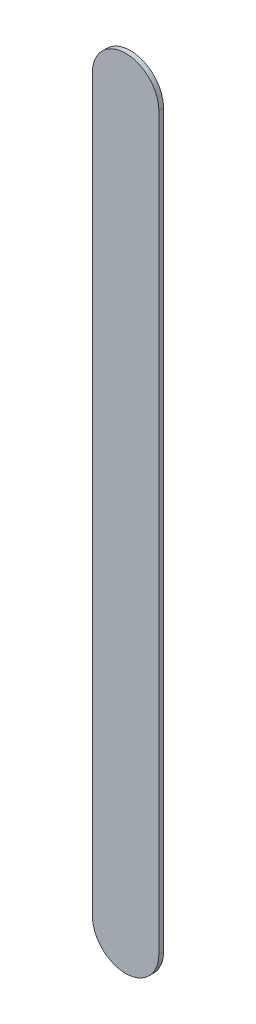
ISO-10303-21;
HEADER;
FILE_DESCRIPTION(('STEP AP214'),'2;1');
FILE_NAME('part.step','',(''),(''),'','','');
FILE_SCHEMA(('AUTOMOTIVE_DESIGN { 1 0 10303 214 1 1 1 1 }'));
ENDSEC;
DATA;
#1=APPLICATION_CONTEXT('core data for automotive mechanical design processes');
#2=APPLICATION_PROTOCOL_DEFINITION('international standard','automotive_design',2000,#1);
#3=PRODUCT_CONTEXT('',#1,'mechanical');
#4=PRODUCT('Part','Part','',(#3));
#5=PRODUCT_RELATED_PRODUCT_CATEGORY('part','',(#4));
#6=PRODUCT_DEFINITION_FORMATION('','',#4);
#7=PRODUCT_DEFINITION_CONTEXT('part definition',#1,'design');
#8=PRODUCT_DEFINITION('design','',#6,#7);
#9=PRODUCT_DEFINITION_SHAPE('','',#8);
#10=(LENGTH_UNIT() NAMED_UNIT(*) SI_UNIT(.MILLI.,.METRE.));
#11=(NAMED_UNIT(*) PLANE_ANGLE_UNIT() SI_UNIT($,.RADIAN.));
#12=(NAMED_UNIT(*) SI_UNIT($,.STERADIAN.) SOLID_ANGLE_UNIT());
#13=UNCERTAINTY_MEASURE_WITH_UNIT(LENGTH_MEASURE(1.E-05),#10,'distance_accuracy_value','');
#14=(GEOMETRIC_REPRESENTATION_CONTEXT(3) GLOBAL_UNCERTAINTY_ASSIGNED_CONTEXT((#13)) GLOBAL_UNIT_ASSIGNED_CONTEXT((#10,
#11,#12)) REPRESENTATION_CONTEXT('',''));
#15=CARTESIAN_POINT('',(0.,0.,0.));
#16=DIRECTION('',(0.,0.,1.));
#17=DIRECTION('',(1.,0.,0.));
#18=AXIS2_PLACEMENT_3D('',#15,#16,#17);
#19=CARTESIAN_POINT('',(35.51757692,99.86757776,0.));
#20=DIRECTION('',(-1.,0.,0.));
#21=DIRECTION('',(0.,1.,0.));
#22=AXIS2_PLACEMENT_3D('',#19,#20,#21);
#23=PLANE('',#22);
#24=DIRECTION('',(0.,1.,0.));
#25=VECTOR('',#24,1.);
#26=CARTESIAN_POINT('',(35.51757692,99.86757776,0.03556));
#27=LINE('',#26,#25);
#28=CARTESIAN_POINT('',(35.51757692,99.86757776,0.03556));
#29=VERTEX_POINT('',#28);
#30=CARTESIAN_POINT('',(35.51757692,105.36757692,0.03556));
#31=VERTEX_POINT('',#30);
#32=EDGE_CURVE('E11',#29,#31,#27,.T.);
#33=ORIENTED_EDGE('',*,*,#32,.F.);
#34=DIRECTION('',(0.,0.,1.));
#35=VECTOR('',#34,1.);
#36=CARTESIAN_POINT('',(35.51757692,99.86757776,0.));
#37=LINE('',#36,#35);
#38=CARTESIAN_POINT('',(35.51757692,99.86757776,0.));
#39=VERTEX_POINT('',#38);
#40=EDGE_CURVE('E24',#39,#29,#37,.T.);
#41=ORIENTED_EDGE('',*,*,#40,.F.);
#42=DIRECTION('',(0.,1.,0.));
#43=VECTOR('',#42,1.);
#44=CARTESIAN_POINT('',(35.51757692,99.86757776,0.));
#45=LINE('',#44,#43);
#46=CARTESIAN_POINT('',(35.51757692,105.36757692,0.));
#47=VERTEX_POINT('',#46);
#48=EDGE_CURVE('E75',#39,#47,#45,.T.);
#49=ORIENTED_EDGE('',*,*,#48,.T.);
#50=DIRECTION('',(0.,0.,1.));
#51=VECTOR('',#50,1.);
#52=CARTESIAN_POINT('',(35.51757692,105.36757692,0.));
#53=LINE('',#52,#51);
#54=EDGE_CURVE('E37',#47,#31,#53,.T.);
#55=ORIENTED_EDGE('',*,*,#54,.T.);
#56=EDGE_LOOP('',(#33,#41,#49,#55));
#57=FACE_BOUND('',#56,.T.);
#58=ADVANCED_FACE('F17',(#57),#23,.F.);
#59=CARTESIAN_POINT('',(35.26757742,105.36757692,0.));
#60=DIRECTION('',(0.,0.,-1.));
#61=DIRECTION('',(1.,0.,0.));
#62=AXIS2_PLACEMENT_3D('',#59,#60,#61);
#63=CYLINDRICAL_SURFACE('',#62,0.249999499999994);
#64=CARTESIAN_POINT('',(35.26757742,105.36757692,0.03556));
#65=DIRECTION('',(0.,0.,1.));
#66=DIRECTION('',(1.,0.,0.));
#67=AXIS2_PLACEMENT_3D('',#64,#65,#66);
#68=CIRCLE('',#67,0.249999499999994);
#69=CARTESIAN_POINT('',(35.01757792,105.36757692,0.03556));
#70=VERTEX_POINT('',#69);
#71=EDGE_CURVE('E83',#31,#70,#68,.T.);
#72=ORIENTED_EDGE('',*,*,#71,.F.);
#73=ORIENTED_EDGE('',*,*,#54,.F.);
#74=CARTESIAN_POINT('',(35.26757742,105.36757692,0.));
#75=DIRECTION('',(0.,0.,1.));
#76=DIRECTION('',(1.,0.,0.));
#77=AXIS2_PLACEMENT_3D('',#74,#75,#76);
#78=CIRCLE('',#77,0.249999499999994);
#79=CARTESIAN_POINT('',(35.01757792,105.36757692,0.));
#80=VERTEX_POINT('',#79);
#81=EDGE_CURVE('E81',#47,#80,#78,.T.);
#82=ORIENTED_EDGE('',*,*,#81,.T.);
#83=DIRECTION('',(0.,0.,1.));
#84=VECTOR('',#83,1.);
#85=CARTESIAN_POINT('',(35.01757792,105.36757692,0.));
#86=LINE('',#85,#84);
#87=EDGE_CURVE('E67',#80,#70,#86,.T.);
#88=ORIENTED_EDGE('',*,*,#87,.T.);
#89=EDGE_LOOP('',(#72,#73,#82,#88));
#90=FACE_BOUND('',#89,.T.);
#91=ADVANCED_FACE('F89',(#90),#63,.T.);
#92=CARTESIAN_POINT('',(35.01757792,105.36757692,0.));
#93=DIRECTION('',(1.,0.,0.));
#94=DIRECTION('',(0.,-1.,0.));
#95=AXIS2_PLACEMENT_3D('',#92,#93,#94);
#96=PLANE('',#95);
#97=DIRECTION('',(0.,-1.,0.));
#98=VECTOR('',#97,1.);
#99=CARTESIAN_POINT('',(35.01757792,105.36757692,0.03556));
#100=LINE('',#99,#98);
#101=CARTESIAN_POINT('',(35.01757792,99.86757776,0.03556));
#102=VERTEX_POINT('',#101);
#103=EDGE_CURVE('E71',#70,#102,#100,.T.);
#104=ORIENTED_EDGE('',*,*,#103,.F.);
#105=ORIENTED_EDGE('',*,*,#87,.F.);
#106=DIRECTION('',(0.,-1.,0.));
#107=VECTOR('',#106,1.);
#108=CARTESIAN_POINT('',(35.01757792,105.36757692,0.));
#109=LINE('',#108,#107);
#110=CARTESIAN_POINT('',(35.01757792,99.86757776,0.));
#111=VERTEX_POINT('',#110);
#112=EDGE_CURVE('E63',#80,#111,#109,.T.);
#113=ORIENTED_EDGE('',*,*,#112,.T.);
#114=DIRECTION('',(0.,0.,1.));
#115=VECTOR('',#114,1.);
#116=CARTESIAN_POINT('',(35.01757792,99.86757776,0.));
#117=LINE('',#116,#115);
#118=EDGE_CURVE('E53',#111,#102,#117,.T.);
#119=ORIENTED_EDGE('',*,*,#118,.T.);
#120=EDGE_LOOP('',(#104,#105,#113,#119));
#121=FACE_BOUND('',#120,.T.);
#122=ADVANCED_FACE('F66',(#121),#96,.F.);
#123=CARTESIAN_POINT('',(35.26757742,99.86757776,0.));
#124=DIRECTION('',(0.,0.,-1.));
#125=DIRECTION('',(-1.,0.,0.));
#126=AXIS2_PLACEMENT_3D('',#123,#124,#125);
#127=CYLINDRICAL_SURFACE('',#126,0.249999499999999);
#128=CARTESIAN_POINT('',(35.26757742,99.86757776,0.03556));
#129=DIRECTION('',(0.,0.,1.));
#130=DIRECTION('',(-1.,0.,0.));
#131=AXIS2_PLACEMENT_3D('',#128,#129,#130);
#132=CIRCLE('',#131,0.249999499999999);
#133=EDGE_CURVE('E59',#102,#29,#132,.T.);
#134=ORIENTED_EDGE('',*,*,#133,.F.);
#135=ORIENTED_EDGE('',*,*,#118,.F.);
#136=CARTESIAN_POINT('',(35.26757742,99.86757776,0.));
#137=DIRECTION('',(0.,0.,1.));
#138=DIRECTION('',(-1.,0.,0.));
#139=AXIS2_PLACEMENT_3D('',#136,#137,#138);
#140=CIRCLE('',#139,0.249999499999999);
#141=EDGE_CURVE('E57',#111,#39,#140,.T.);
#142=ORIENTED_EDGE('',*,*,#141,.T.);
#143=ORIENTED_EDGE('',*,*,#40,.T.);
#144=EDGE_LOOP('',(#134,#135,#142,#143));
#145=FACE_BOUND('',#144,.T.);
#146=ADVANCED_FACE('F55',(#145),#127,.T.);
#147=CARTESIAN_POINT('',(35.51757692,99.86757776,0.));
#148=DIRECTION('',(0.,0.,-1.));
#149=DIRECTION('',(-1.,0.,0.));
#150=AXIS2_PLACEMENT_3D('',#147,#148,#149);
#151=PLANE('',#150);
#152=ORIENTED_EDGE('',*,*,#141,.F.);
#153=ORIENTED_EDGE('',*,*,#112,.F.);
#154=ORIENTED_EDGE('',*,*,#81,.F.);
#155=ORIENTED_EDGE('',*,*,#48,.F.);
#156=EDGE_LOOP('',(#152,#153,#154,#155));
#157=FACE_BOUND('',#156,.T.);
#158=ADVANCED_FACE('F74',(#157),#151,.T.);
#159=CARTESIAN_POINT('',(35.51757692,99.86757776,0.03556));
#160=DIRECTION('',(0.,0.,-1.));
#161=DIRECTION('',(-1.,0.,0.));
#162=AXIS2_PLACEMENT_3D('',#159,#160,#161);
#163=PLANE('',#162);
#164=ORIENTED_EDGE('',*,*,#32,.T.);
#165=ORIENTED_EDGE('',*,*,#71,.T.);
#166=ORIENTED_EDGE('',*,*,#103,.T.);
#167=ORIENTED_EDGE('',*,*,#133,.T.);
#168=EDGE_LOOP('',(#164,#165,#166,#167));
#169=FACE_BOUND('',#168,.T.);
#170=ADVANCED_FACE('F91',(#169),#163,.F.);
#171=CLOSED_SHELL('',(#58,#91,#122,#146,#158,#170));
#172=MANIFOLD_SOLID_BREP('B1',#171);
#173=ADVANCED_BREP_SHAPE_REPRESENTATION('',(#18,#172),#14);
#174=SHAPE_DEFINITION_REPRESENTATION(#9,#173);
ENDSEC;
END-ISO-10303-21;
